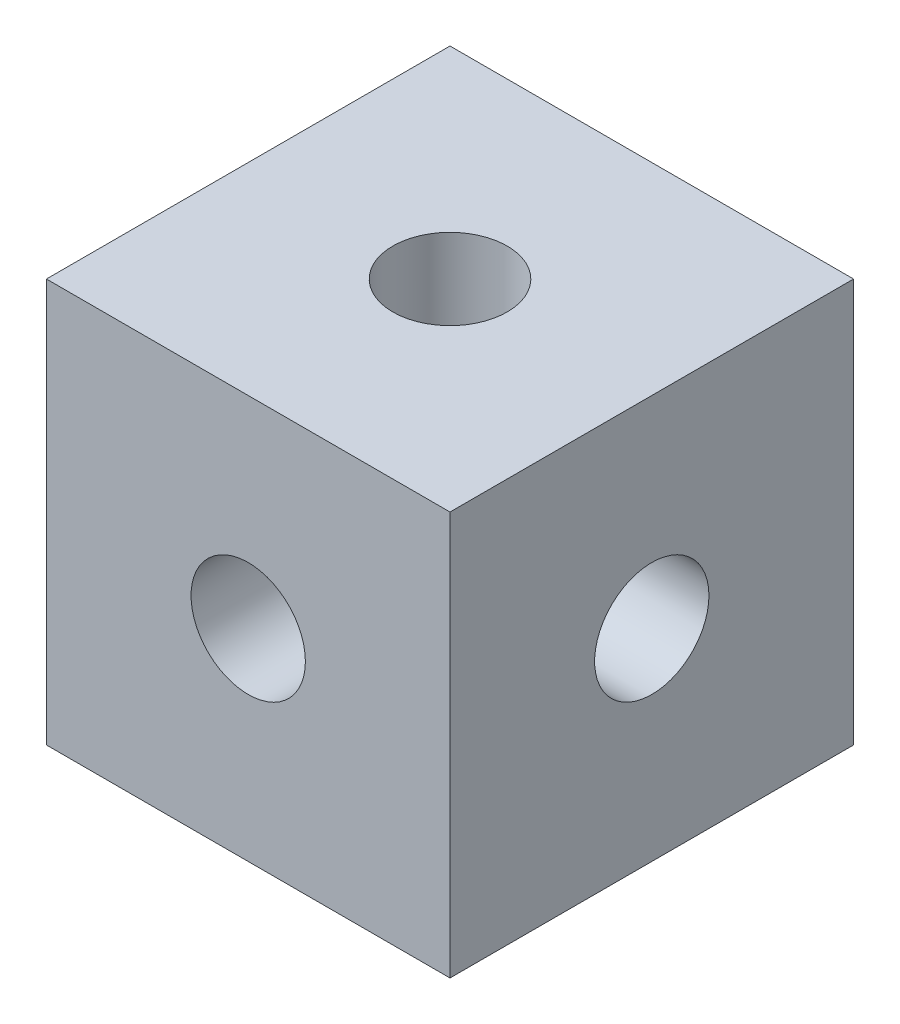
ISO-10303-21;
HEADER;
FILE_DESCRIPTION(('STEP AP214'),'2;1');
FILE_NAME('part.step','',(''),(''),'','','');
FILE_SCHEMA(('AUTOMOTIVE_DESIGN { 1 0 10303 214 1 1 1 1 }'));
ENDSEC;
DATA;
#1=APPLICATION_CONTEXT('core data for automotive mechanical design processes');
#2=APPLICATION_PROTOCOL_DEFINITION('international standard','automotive_design',2000,#1);
#3=PRODUCT_CONTEXT('',#1,'mechanical');
#4=PRODUCT('Part','Part','',(#3));
#5=PRODUCT_RELATED_PRODUCT_CATEGORY('part','',(#4));
#6=PRODUCT_DEFINITION_FORMATION('','',#4);
#7=PRODUCT_DEFINITION_CONTEXT('part definition',#1,'design');
#8=PRODUCT_DEFINITION('design','',#6,#7);
#9=PRODUCT_DEFINITION_SHAPE('','',#8);
#10=(LENGTH_UNIT() NAMED_UNIT(*) SI_UNIT(.MILLI.,.METRE.));
#11=(NAMED_UNIT(*) PLANE_ANGLE_UNIT() SI_UNIT($,.RADIAN.));
#12=(NAMED_UNIT(*) SI_UNIT($,.STERADIAN.) SOLID_ANGLE_UNIT());
#13=UNCERTAINTY_MEASURE_WITH_UNIT(LENGTH_MEASURE(1.E-05),#10,'distance_accuracy_value','');
#14=(GEOMETRIC_REPRESENTATION_CONTEXT(3) GLOBAL_UNCERTAINTY_ASSIGNED_CONTEXT((#13)) GLOBAL_UNIT_ASSIGNED_CONTEXT((#10,
#11,#12)) REPRESENTATION_CONTEXT('',''));
#15=CARTESIAN_POINT('',(0.,0.,0.));
#16=DIRECTION('',(0.,0.,1.));
#17=DIRECTION('',(1.,0.,0.));
#18=AXIS2_PLACEMENT_3D('',#15,#16,#17);
#19=CARTESIAN_POINT('',(0.,6.,6.));
#20=DIRECTION('',(0.,0.,1.));
#21=DIRECTION('',(1.,0.,0.));
#22=AXIS2_PLACEMENT_3D('',#19,#20,#21);
#23=CYLINDRICAL_SURFACE('',#22,1.7);
#24=CARTESIAN_POINT('',(0.,6.,6.));
#25=DIRECTION('',(0.,0.,1.));
#26=DIRECTION('',(1.,0.,0.));
#27=AXIS2_PLACEMENT_3D('',#24,#25,#26);
#28=CIRCLE('',#27,1.7);
#29=CARTESIAN_POINT('',(1.7,6.,6.));
#30=VERTEX_POINT('',#29);
#31=EDGE_CURVE('E141',#30,#30,#28,.T.);
#32=ORIENTED_EDGE('',*,*,#31,.T.);
#33=EDGE_LOOP('',(#32));
#34=FACE_BOUND('',#33,.T.);
#35=CARTESIAN_POINT('',(0.,6.,0.));
#36=DIRECTION('',(-0.707106781186547,0.,0.707106781186547));
#37=DIRECTION('',(0.707106781186547,0.,0.707106781186547));
#38=AXIS2_PLACEMENT_3D('',#35,#36,#37);
#39=ELLIPSE('',#38,2.40416305603426,1.7);
#40=CARTESIAN_POINT('',(1.20208152801713,7.20208152801713,1.20208152801713));
#41=VERTEX_POINT('',#40);
#42=CARTESIAN_POINT('',(1.20208152801713,4.79791847198287,1.20208152801713));
#43=VERTEX_POINT('',#42);
#44=EDGE_CURVE('E107',#41,#43,#39,.F.);
#45=ORIENTED_EDGE('',*,*,#44,.T.);
#46=CARTESIAN_POINT('',(0.,6.,0.));
#47=DIRECTION('',(0.,0.707106781186547,0.707106781186547));
#48=DIRECTION('',(0.,-0.707106781186547,0.707106781186547));
#49=AXIS2_PLACEMENT_3D('',#46,#47,#48);
#50=ELLIPSE('',#49,2.40416305603426,1.7);
#51=CARTESIAN_POINT('',(-1.20208152801713,4.79791847198287,1.20208152801713));
#52=VERTEX_POINT('',#51);
#53=EDGE_CURVE('E128',#43,#52,#50,.F.);
#54=ORIENTED_EDGE('',*,*,#53,.T.);
#55=CARTESIAN_POINT('',(0.,6.,0.));
#56=DIRECTION('',(0.707106781186547,0.,0.707106781186547));
#57=DIRECTION('',(-0.707106781186547,0.,0.707106781186547));
#58=AXIS2_PLACEMENT_3D('',#55,#56,#57);
#59=ELLIPSE('',#58,2.40416305603426,1.7);
#60=CARTESIAN_POINT('',(-1.20208152801713,7.20208152801713,1.20208152801713));
#61=VERTEX_POINT('',#60);
#62=EDGE_CURVE('E102',#52,#61,#59,.F.);
#63=ORIENTED_EDGE('',*,*,#62,.T.);
#64=CARTESIAN_POINT('',(0.,6.,0.));
#65=DIRECTION('',(0.,-0.707106781186547,0.707106781186547));
#66=DIRECTION('',(0.,0.707106781186547,0.707106781186547));
#67=AXIS2_PLACEMENT_3D('',#64,#65,#66);
#68=ELLIPSE('',#67,2.40416305603426,1.7);
#69=EDGE_CURVE('E96',#61,#41,#68,.F.);
#70=ORIENTED_EDGE('',*,*,#69,.T.);
#71=EDGE_LOOP('',(#45,#54,#63,#70));
#72=FACE_BOUND('',#71,.T.);
#73=ADVANCED_FACE('F32',(#34,#72),#23,.F.);
#74=CARTESIAN_POINT('',(6.,12.,6.));
#75=DIRECTION('',(-1.,0.,0.));
#76=DIRECTION('',(0.,0.,1.));
#77=AXIS2_PLACEMENT_3D('',#74,#75,#76);
#78=PLANE('',#77);
#79=CARTESIAN_POINT('',(6.,6.,0.));
#80=DIRECTION('',(1.,0.,0.));
#81=DIRECTION('',(0.,0.,-1.));
#82=AXIS2_PLACEMENT_3D('',#79,#80,#81);
#83=CIRCLE('',#82,1.69999999999999);
#84=CARTESIAN_POINT('',(6.,6.,-1.69999999999999));
#85=VERTEX_POINT('',#84);
#86=EDGE_CURVE('E131',#85,#85,#83,.T.);
#87=ORIENTED_EDGE('',*,*,#86,.F.);
#88=EDGE_LOOP('',(#87));
#89=FACE_BOUND('',#88,.T.);
#90=DIRECTION('',(0.,0.,-1.));
#91=VECTOR('',#90,1.);
#92=CARTESIAN_POINT('',(6.,0.,6.));
#93=LINE('',#92,#91);
#94=CARTESIAN_POINT('',(6.,0.,6.));
#95=VERTEX_POINT('',#94);
#96=CARTESIAN_POINT('',(6.,0.,-6.));
#97=VERTEX_POINT('',#96);
#98=EDGE_CURVE('E147',#95,#97,#93,.T.);
#99=ORIENTED_EDGE('',*,*,#98,.T.);
#100=DIRECTION('',(0.,-1.,0.));
#101=VECTOR('',#100,1.);
#102=CARTESIAN_POINT('',(6.,12.,-6.));
#103=LINE('',#102,#101);
#104=CARTESIAN_POINT('',(6.,12.,-6.));
#105=VERTEX_POINT('',#104);
#106=EDGE_CURVE('E113',#105,#97,#103,.T.);
#107=ORIENTED_EDGE('',*,*,#106,.F.);
#108=DIRECTION('',(0.,0.,-1.));
#109=VECTOR('',#108,1.);
#110=CARTESIAN_POINT('',(6.,12.,6.));
#111=LINE('',#110,#109);
#112=CARTESIAN_POINT('',(6.,12.,6.));
#113=VERTEX_POINT('',#112);
#114=EDGE_CURVE('E148',#113,#105,#111,.T.);
#115=ORIENTED_EDGE('',*,*,#114,.F.);
#116=DIRECTION('',(0.,-1.,0.));
#117=VECTOR('',#116,1.);
#118=CARTESIAN_POINT('',(6.,12.,6.));
#119=LINE('',#118,#117);
#120=EDGE_CURVE('E158',#113,#95,#119,.T.);
#121=ORIENTED_EDGE('',*,*,#120,.T.);
#122=EDGE_LOOP('',(#99,#107,#115,#121));
#123=FACE_BOUND('',#122,.T.);
#124=ADVANCED_FACE('F34',(#89,#123),#78,.F.);
#125=CARTESIAN_POINT('',(-6.,12.,-6.));
#126=DIRECTION('',(0.,0.,1.));
#127=DIRECTION('',(1.,0.,0.));
#128=AXIS2_PLACEMENT_3D('',#125,#126,#127);
#129=PLANE('',#128);
#130=CARTESIAN_POINT('',(0.,6.,-6.));
#131=DIRECTION('',(0.,0.,1.));
#132=DIRECTION('',(1.,0.,0.));
#133=AXIS2_PLACEMENT_3D('',#130,#131,#132);
#134=CIRCLE('',#133,1.7);
#135=CARTESIAN_POINT('',(1.7,6.,-6.));
#136=VERTEX_POINT('',#135);
#137=EDGE_CURVE('E144',#136,#136,#134,.T.);
#138=ORIENTED_EDGE('',*,*,#137,.T.);
#139=EDGE_LOOP('',(#138));
#140=FACE_BOUND('',#139,.T.);
#141=DIRECTION('',(-1.,0.,0.));
#142=VECTOR('',#141,1.);
#143=CARTESIAN_POINT('',(-6.,0.,-6.));
#144=LINE('',#143,#142);
#145=CARTESIAN_POINT('',(-6.,0.,-6.));
#146=VERTEX_POINT('',#145);
#147=EDGE_CURVE('E161',#97,#146,#144,.T.);
#148=ORIENTED_EDGE('',*,*,#147,.T.);
#149=DIRECTION('',(0.,-1.,0.));
#150=VECTOR('',#149,1.);
#151=CARTESIAN_POINT('',(-6.,12.,-6.));
#152=LINE('',#151,#150);
#153=CARTESIAN_POINT('',(-6.,12.,-6.));
#154=VERTEX_POINT('',#153);
#155=EDGE_CURVE('E119',#154,#146,#152,.T.);
#156=ORIENTED_EDGE('',*,*,#155,.F.);
#157=DIRECTION('',(-1.,0.,0.));
#158=VECTOR('',#157,1.);
#159=CARTESIAN_POINT('',(-6.,12.,-6.));
#160=LINE('',#159,#158);
#161=EDGE_CURVE('E151',#105,#154,#160,.T.);
#162=ORIENTED_EDGE('',*,*,#161,.F.);
#163=ORIENTED_EDGE('',*,*,#106,.T.);
#164=EDGE_LOOP('',(#148,#156,#162,#163));
#165=FACE_BOUND('',#164,.T.);
#166=ADVANCED_FACE('F191',(#140,#165),#129,.F.);
#167=CARTESIAN_POINT('',(-6.,12.,6.));
#168=DIRECTION('',(1.,0.,0.));
#169=DIRECTION('',(0.,0.,-1.));
#170=AXIS2_PLACEMENT_3D('',#167,#168,#169);
#171=PLANE('',#170);
#172=CARTESIAN_POINT('',(-6.,6.,0.));
#173=DIRECTION('',(1.,0.,0.));
#174=DIRECTION('',(0.,0.,-1.));
#175=AXIS2_PLACEMENT_3D('',#172,#173,#174);
#176=CIRCLE('',#175,1.7);
#177=CARTESIAN_POINT('',(-6.,6.,-1.7));
#178=VERTEX_POINT('',#177);
#179=EDGE_CURVE('E138',#178,#178,#176,.T.);
#180=ORIENTED_EDGE('',*,*,#179,.T.);
#181=EDGE_LOOP('',(#180));
#182=FACE_BOUND('',#181,.T.);
#183=DIRECTION('',(0.,0.,1.));
#184=VECTOR('',#183,1.);
#185=CARTESIAN_POINT('',(-6.,0.,6.));
#186=LINE('',#185,#184);
#187=CARTESIAN_POINT('',(-6.,0.,6.));
#188=VERTEX_POINT('',#187);
#189=EDGE_CURVE('E163',#146,#188,#186,.T.);
#190=ORIENTED_EDGE('',*,*,#189,.T.);
#191=DIRECTION('',(0.,-1.,0.));
#192=VECTOR('',#191,1.);
#193=CARTESIAN_POINT('',(-6.,12.,6.));
#194=LINE('',#193,#192);
#195=CARTESIAN_POINT('',(-6.,12.,6.));
#196=VERTEX_POINT('',#195);
#197=EDGE_CURVE('E168',#196,#188,#194,.T.);
#198=ORIENTED_EDGE('',*,*,#197,.F.);
#199=DIRECTION('',(0.,0.,1.));
#200=VECTOR('',#199,1.);
#201=CARTESIAN_POINT('',(-6.,12.,6.));
#202=LINE('',#201,#200);
#203=EDGE_CURVE('E154',#154,#196,#202,.T.);
#204=ORIENTED_EDGE('',*,*,#203,.F.);
#205=ORIENTED_EDGE('',*,*,#155,.T.);
#206=EDGE_LOOP('',(#190,#198,#204,#205));
#207=FACE_BOUND('',#206,.T.);
#208=ADVANCED_FACE('F175',(#182,#207),#171,.F.);
#209=CARTESIAN_POINT('',(-6.,12.,6.));
#210=DIRECTION('',(0.,0.,-1.));
#211=DIRECTION('',(-1.,0.,0.));
#212=AXIS2_PLACEMENT_3D('',#209,#210,#211);
#213=PLANE('',#212);
#214=ORIENTED_EDGE('',*,*,#31,.F.);
#215=EDGE_LOOP('',(#214));
#216=FACE_BOUND('',#215,.T.);
#217=DIRECTION('',(1.,0.,0.));
#218=VECTOR('',#217,1.);
#219=CARTESIAN_POINT('',(-6.,0.,6.));
#220=LINE('',#219,#218);
#221=EDGE_CURVE('E152',#188,#95,#220,.T.);
#222=ORIENTED_EDGE('',*,*,#221,.T.);
#223=ORIENTED_EDGE('',*,*,#120,.F.);
#224=DIRECTION('',(1.,0.,0.));
#225=VECTOR('',#224,1.);
#226=CARTESIAN_POINT('',(-6.,12.,6.));
#227=LINE('',#226,#225);
#228=EDGE_CURVE('E156',#196,#113,#227,.T.);
#229=ORIENTED_EDGE('',*,*,#228,.F.);
#230=ORIENTED_EDGE('',*,*,#197,.T.);
#231=EDGE_LOOP('',(#222,#223,#229,#230));
#232=FACE_BOUND('',#231,.T.);
#233=ADVANCED_FACE('F184',(#216,#232),#213,.F.);
#234=CARTESIAN_POINT('',(0.,12.,0.));
#235=DIRECTION('',(0.,-1.,0.));
#236=DIRECTION('',(0.,0.,-1.));
#237=AXIS2_PLACEMENT_3D('',#234,#235,#236);
#238=PLANE('',#237);
#239=CARTESIAN_POINT('',(0.,12.,0.));
#240=DIRECTION('',(0.,1.,0.));
#241=DIRECTION('',(0.,0.,1.));
#242=AXIS2_PLACEMENT_3D('',#239,#240,#241);
#243=CIRCLE('',#242,1.69999999999999);
#244=CARTESIAN_POINT('',(0.,12.,1.69999999999999));
#245=VERTEX_POINT('',#244);
#246=EDGE_CURVE('E287',#245,#245,#243,.T.);
#247=ORIENTED_EDGE('',*,*,#246,.F.);
#248=EDGE_LOOP('',(#247));
#249=FACE_BOUND('',#248,.T.);
#250=ORIENTED_EDGE('',*,*,#114,.T.);
#251=ORIENTED_EDGE('',*,*,#161,.T.);
#252=ORIENTED_EDGE('',*,*,#203,.T.);
#253=ORIENTED_EDGE('',*,*,#228,.T.);
#254=EDGE_LOOP('',(#250,#251,#252,#253));
#255=FACE_BOUND('',#254,.T.);
#256=ADVANCED_FACE('F190',(#249,#255),#238,.F.);
#257=CARTESIAN_POINT('',(0.,0.,0.));
#258=DIRECTION('',(0.,-1.,0.));
#259=DIRECTION('',(0.,0.,-1.));
#260=AXIS2_PLACEMENT_3D('',#257,#258,#259);
#261=PLANE('',#260);
#262=CARTESIAN_POINT('',(0.,0.,0.));
#263=DIRECTION('',(0.,1.,0.));
#264=DIRECTION('',(0.,0.,1.));
#265=AXIS2_PLACEMENT_3D('',#262,#263,#264);
#266=CIRCLE('',#265,1.7);
#267=CARTESIAN_POINT('',(0.,0.,1.7));
#268=VERTEX_POINT('',#267);
#269=EDGE_CURVE('E282',#268,#268,#266,.T.);
#270=ORIENTED_EDGE('',*,*,#269,.T.);
#271=EDGE_LOOP('',(#270));
#272=FACE_BOUND('',#271,.T.);
#273=ORIENTED_EDGE('',*,*,#98,.F.);
#274=ORIENTED_EDGE('',*,*,#221,.F.);
#275=ORIENTED_EDGE('',*,*,#189,.F.);
#276=ORIENTED_EDGE('',*,*,#147,.F.);
#277=EDGE_LOOP('',(#273,#274,#275,#276));
#278=FACE_BOUND('',#277,.T.);
#279=ADVANCED_FACE('F181',(#272,#278),#261,.T.);
#280=CARTESIAN_POINT('',(0.,6.,0.));
#281=DIRECTION('',(0.707106781186547,0.,0.707106781186547));
#282=DIRECTION('',(-0.707106781186547,0.,0.707106781186547));
#283=AXIS2_PLACEMENT_3D('',#280,#281,#282);
#284=ELLIPSE('',#283,2.40416305603426,1.7);
#285=CARTESIAN_POINT('',(1.20208152801713,4.79791847198287,-1.20208152801713));
#286=VERTEX_POINT('',#285);
#287=CARTESIAN_POINT('',(1.20208152801713,7.20208152801713,-1.20208152801713));
#288=VERTEX_POINT('',#287);
#289=EDGE_CURVE('E116',#286,#288,#284,.T.);
#290=ORIENTED_EDGE('',*,*,#289,.T.);
#291=CARTESIAN_POINT('',(0.,6.,0.));
#292=DIRECTION('',(0.,0.707106781186547,0.707106781186547));
#293=DIRECTION('',(0.,-0.707106781186547,0.707106781186547));
#294=AXIS2_PLACEMENT_3D('',#291,#292,#293);
#295=ELLIPSE('',#294,2.40416305603426,1.7);
#296=CARTESIAN_POINT('',(-1.20208152801713,7.20208152801713,-1.20208152801713));
#297=VERTEX_POINT('',#296);
#298=EDGE_CURVE('E55',#288,#297,#295,.T.);
#299=ORIENTED_EDGE('',*,*,#298,.T.);
#300=CARTESIAN_POINT('',(0.,6.,0.));
#301=DIRECTION('',(-0.707106781186547,0.,0.707106781186547));
#302=DIRECTION('',(0.707106781186547,0.,0.707106781186547));
#303=AXIS2_PLACEMENT_3D('',#300,#301,#302);
#304=ELLIPSE('',#303,2.40416305603426,1.7);
#305=CARTESIAN_POINT('',(-1.20208152801713,4.79791847198287,-1.20208152801713));
#306=VERTEX_POINT('',#305);
#307=EDGE_CURVE('E112',#297,#306,#304,.T.);
#308=ORIENTED_EDGE('',*,*,#307,.T.);
#309=CARTESIAN_POINT('',(0.,6.,0.));
#310=DIRECTION('',(0.,-0.707106781186547,0.707106781186547));
#311=DIRECTION('',(0.,0.707106781186547,0.707106781186547));
#312=AXIS2_PLACEMENT_3D('',#309,#310,#311);
#313=ELLIPSE('',#312,2.40416305603426,1.7);
#314=EDGE_CURVE('E47',#306,#286,#313,.T.);
#315=ORIENTED_EDGE('',*,*,#314,.T.);
#316=EDGE_LOOP('',(#290,#299,#308,#315));
#317=FACE_BOUND('',#316,.T.);
#318=ORIENTED_EDGE('',*,*,#137,.F.);
#319=EDGE_LOOP('',(#318));
#320=FACE_BOUND('',#319,.T.);
#321=ADVANCED_FACE('F125',(#317,#320),#23,.F.);
#322=CARTESIAN_POINT('',(6.,6.,0.));
#323=DIRECTION('',(1.,0.,0.));
#324=DIRECTION('',(0.,0.,-1.));
#325=AXIS2_PLACEMENT_3D('',#322,#323,#324);
#326=CYLINDRICAL_SURFACE('',#325,1.69999999999999);
#327=ORIENTED_EDGE('',*,*,#86,.T.);
#328=EDGE_LOOP('',(#327));
#329=FACE_BOUND('',#328,.T.);
#330=ORIENTED_EDGE('',*,*,#289,.F.);
#331=CARTESIAN_POINT('',(0.,6.,0.));
#332=DIRECTION('',(0.707106781186547,0.707106781186547,0.));
#333=DIRECTION('',(0.707106781186547,-0.707106781186547,0.));
#334=AXIS2_PLACEMENT_3D('',#331,#332,#333);
#335=ELLIPSE('',#334,2.40416305603425,1.69999999999999);
#336=EDGE_CURVE('E11',#286,#43,#335,.F.);
#337=ORIENTED_EDGE('',*,*,#336,.T.);
#338=ORIENTED_EDGE('',*,*,#44,.F.);
#339=CARTESIAN_POINT('',(0.,6.,0.));
#340=DIRECTION('',(0.707106781186547,-0.707106781186547,0.));
#341=DIRECTION('',(0.707106781186547,0.707106781186547,0.));
#342=AXIS2_PLACEMENT_3D('',#339,#340,#341);
#343=ELLIPSE('',#342,2.40416305603425,1.69999999999999);
#344=EDGE_CURVE('E40',#41,#288,#343,.F.);
#345=ORIENTED_EDGE('',*,*,#344,.T.);
#346=EDGE_LOOP('',(#330,#337,#338,#345));
#347=FACE_BOUND('',#346,.T.);
#348=ADVANCED_FACE('F111',(#329,#347),#326,.F.);
#349=ORIENTED_EDGE('',*,*,#179,.F.);
#350=EDGE_LOOP('',(#349));
#351=FACE_BOUND('',#350,.T.);
#352=ORIENTED_EDGE('',*,*,#307,.F.);
#353=CARTESIAN_POINT('',(0.,6.,0.));
#354=DIRECTION('',(0.707106781186547,0.707106781186547,0.));
#355=DIRECTION('',(0.707106781186547,-0.707106781186547,0.));
#356=AXIS2_PLACEMENT_3D('',#353,#354,#355);
#357=ELLIPSE('',#356,2.40416305603425,1.69999999999999);
#358=EDGE_CURVE('E109',#297,#61,#357,.T.);
#359=ORIENTED_EDGE('',*,*,#358,.T.);
#360=ORIENTED_EDGE('',*,*,#62,.F.);
#361=CARTESIAN_POINT('',(0.,6.,0.));
#362=DIRECTION('',(0.707106781186547,-0.707106781186547,0.));
#363=DIRECTION('',(0.707106781186547,0.707106781186547,0.));
#364=AXIS2_PLACEMENT_3D('',#361,#362,#363);
#365=ELLIPSE('',#364,2.40416305603425,1.69999999999999);
#366=EDGE_CURVE('E129',#52,#306,#365,.T.);
#367=ORIENTED_EDGE('',*,*,#366,.T.);
#368=EDGE_LOOP('',(#352,#359,#360,#367));
#369=FACE_BOUND('',#368,.T.);
#370=ADVANCED_FACE('F213',(#351,#369),#326,.F.);
#371=CARTESIAN_POINT('',(0.,12.,0.));
#372=DIRECTION('',(0.,1.,0.));
#373=DIRECTION('',(0.,0.,1.));
#374=AXIS2_PLACEMENT_3D('',#371,#372,#373);
#375=CYLINDRICAL_SURFACE('',#374,1.69999999999999);
#376=ORIENTED_EDGE('',*,*,#246,.T.);
#377=EDGE_LOOP('',(#376));
#378=FACE_BOUND('',#377,.T.);
#379=ORIENTED_EDGE('',*,*,#298,.F.);
#380=ORIENTED_EDGE('',*,*,#344,.F.);
#381=ORIENTED_EDGE('',*,*,#69,.F.);
#382=ORIENTED_EDGE('',*,*,#358,.F.);
#383=EDGE_LOOP('',(#379,#380,#381,#382));
#384=FACE_BOUND('',#383,.T.);
#385=ADVANCED_FACE('F95',(#378,#384),#375,.F.);
#386=ORIENTED_EDGE('',*,*,#269,.F.);
#387=EDGE_LOOP('',(#386));
#388=FACE_BOUND('',#387,.T.);
#389=ORIENTED_EDGE('',*,*,#336,.F.);
#390=ORIENTED_EDGE('',*,*,#314,.F.);
#391=ORIENTED_EDGE('',*,*,#366,.F.);
#392=ORIENTED_EDGE('',*,*,#53,.F.);
#393=EDGE_LOOP('',(#389,#390,#391,#392));
#394=FACE_BOUND('',#393,.T.);
#395=ADVANCED_FACE('F268',(#388,#394),#375,.F.);
#396=CLOSED_SHELL('',(#73,#124,#166,#208,#233,#256,#279,#321,#348,#370,#385,#395));
#397=MANIFOLD_SOLID_BREP('B2',#396);
#398=ADVANCED_BREP_SHAPE_REPRESENTATION('',(#18,#397),#14);
#399=SHAPE_DEFINITION_REPRESENTATION(#9,#398);
ENDSEC;
END-ISO-10303-21;
